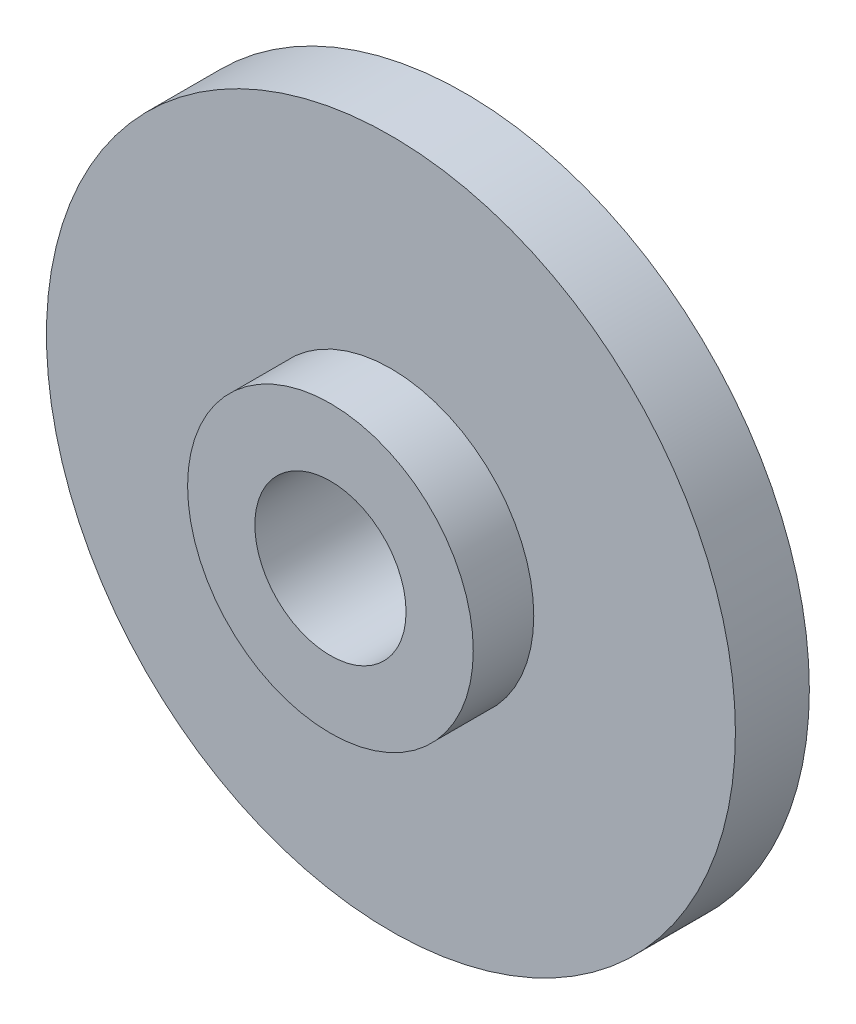
ISO-10303-21;
HEADER;
FILE_DESCRIPTION(('STEP AP214'),'2;1');
FILE_NAME('part.step','',(''),(''),'','','');
FILE_SCHEMA(('AUTOMOTIVE_DESIGN { 1 0 10303 214 1 1 1 1 }'));
ENDSEC;
DATA;
#1=APPLICATION_CONTEXT('core data for automotive mechanical design processes');
#2=APPLICATION_PROTOCOL_DEFINITION('international standard','automotive_design',2000,#1);
#3=PRODUCT_CONTEXT('',#1,'mechanical');
#4=PRODUCT('Part','Part','',(#3));
#5=PRODUCT_RELATED_PRODUCT_CATEGORY('part','',(#4));
#6=PRODUCT_DEFINITION_FORMATION('','',#4);
#7=PRODUCT_DEFINITION_CONTEXT('part definition',#1,'design');
#8=PRODUCT_DEFINITION('design','',#6,#7);
#9=PRODUCT_DEFINITION_SHAPE('','',#8);
#10=(LENGTH_UNIT() NAMED_UNIT(*) SI_UNIT(.MILLI.,.METRE.));
#11=(NAMED_UNIT(*) PLANE_ANGLE_UNIT() SI_UNIT($,.RADIAN.));
#12=(NAMED_UNIT(*) SI_UNIT($,.STERADIAN.) SOLID_ANGLE_UNIT());
#13=UNCERTAINTY_MEASURE_WITH_UNIT(LENGTH_MEASURE(1.E-05),#10,'distance_accuracy_value','');
#14=(GEOMETRIC_REPRESENTATION_CONTEXT(3) GLOBAL_UNCERTAINTY_ASSIGNED_CONTEXT((#13)) GLOBAL_UNIT_ASSIGNED_CONTEXT((#10,
#11,#12)) REPRESENTATION_CONTEXT('',''));
#15=CARTESIAN_POINT('',(0.,0.,0.));
#16=DIRECTION('',(0.,0.,1.));
#17=DIRECTION('',(1.,0.,0.));
#18=AXIS2_PLACEMENT_3D('',#15,#16,#17);
#19=CARTESIAN_POINT('',(0.,0.,2.2));
#20=DIRECTION('',(0.,0.,-1.));
#21=DIRECTION('',(-1.,0.,0.));
#22=AXIS2_PLACEMENT_3D('',#19,#20,#21);
#23=CYLINDRICAL_SURFACE('',#22,10.25);
#24=CARTESIAN_POINT('',(0.,0.,2.2));
#25=DIRECTION('',(0.,0.,1.));
#26=DIRECTION('',(1.,0.,0.));
#27=AXIS2_PLACEMENT_3D('',#24,#25,#26);
#28=CIRCLE('',#27,10.25);
#29=CARTESIAN_POINT('',(10.25,0.,2.2));
#30=VERTEX_POINT('',#29);
#31=EDGE_CURVE('E10',#30,#30,#28,.T.);
#32=ORIENTED_EDGE('',*,*,#31,.F.);
#33=EDGE_LOOP('',(#32));
#34=FACE_BOUND('',#33,.T.);
#35=CARTESIAN_POINT('',(0.,0.,0.));
#36=DIRECTION('',(0.,0.,1.));
#37=DIRECTION('',(1.,0.,0.));
#38=AXIS2_PLACEMENT_3D('',#35,#36,#37);
#39=CIRCLE('',#38,10.25);
#40=CARTESIAN_POINT('',(10.25,0.,0.));
#41=VERTEX_POINT('',#40);
#42=EDGE_CURVE('E44',#41,#41,#39,.T.);
#43=ORIENTED_EDGE('',*,*,#42,.T.);
#44=EDGE_LOOP('',(#43));
#45=FACE_BOUND('',#44,.T.);
#46=ADVANCED_FACE('F41',(#34,#45),#23,.T.);
#47=CARTESIAN_POINT('',(0.,0.,2.2));
#48=DIRECTION('',(0.,0.,1.));
#49=DIRECTION('',(1.,0.,0.));
#50=AXIS2_PLACEMENT_3D('',#47,#48,#49);
#51=PLANE('',#50);
#52=CARTESIAN_POINT('',(0.,0.,2.2));
#53=DIRECTION('',(0.,0.,1.));
#54=DIRECTION('',(1.,0.,0.));
#55=AXIS2_PLACEMENT_3D('',#52,#53,#54);
#56=CIRCLE('',#55,4.25);
#57=CARTESIAN_POINT('',(4.25,0.,2.2));
#58=VERTEX_POINT('',#57);
#59=EDGE_CURVE('E49',#58,#58,#56,.T.);
#60=ORIENTED_EDGE('',*,*,#59,.F.);
#61=EDGE_LOOP('',(#60));
#62=FACE_BOUND('',#61,.T.);
#63=ORIENTED_EDGE('',*,*,#31,.T.);
#64=EDGE_LOOP('',(#63));
#65=FACE_BOUND('',#64,.T.);
#66=ADVANCED_FACE('F88',(#62,#65),#51,.T.);
#67=CARTESIAN_POINT('',(0.,0.,0.));
#68=DIRECTION('',(0.,0.,1.));
#69=DIRECTION('',(1.,0.,0.));
#70=AXIS2_PLACEMENT_3D('',#67,#68,#69);
#71=PLANE('',#70);
#72=ORIENTED_EDGE('',*,*,#42,.F.);
#73=EDGE_LOOP('',(#72));
#74=FACE_BOUND('',#73,.T.);
#75=CARTESIAN_POINT('',(0.,0.,0.));
#76=DIRECTION('',(0.,0.,1.));
#77=DIRECTION('',(1.,0.,0.));
#78=AXIS2_PLACEMENT_3D('',#75,#76,#77);
#79=CIRCLE('',#78,2.25);
#80=CARTESIAN_POINT('',(2.25,0.,0.));
#81=VERTEX_POINT('',#80);
#82=EDGE_CURVE('E56',#81,#81,#79,.T.);
#83=ORIENTED_EDGE('',*,*,#82,.T.);
#84=EDGE_LOOP('',(#83));
#85=FACE_BOUND('',#84,.T.);
#86=ADVANCED_FACE('F85',(#74,#85),#71,.F.);
#87=CARTESIAN_POINT('',(0.,0.,4.));
#88=DIRECTION('',(0.,0.,-1.));
#89=DIRECTION('',(-1.,0.,0.));
#90=AXIS2_PLACEMENT_3D('',#87,#88,#89);
#91=CYLINDRICAL_SURFACE('',#90,2.25);
#92=CARTESIAN_POINT('',(0.,0.,4.));
#93=DIRECTION('',(0.,0.,1.));
#94=DIRECTION('',(1.,0.,0.));
#95=AXIS2_PLACEMENT_3D('',#92,#93,#94);
#96=CIRCLE('',#95,2.25);
#97=CARTESIAN_POINT('',(2.25,0.,4.));
#98=VERTEX_POINT('',#97);
#99=EDGE_CURVE('E60',#98,#98,#96,.T.);
#100=ORIENTED_EDGE('',*,*,#99,.T.);
#101=EDGE_LOOP('',(#100));
#102=FACE_BOUND('',#101,.T.);
#103=ORIENTED_EDGE('',*,*,#82,.F.);
#104=EDGE_LOOP('',(#103));
#105=FACE_BOUND('',#104,.T.);
#106=ADVANCED_FACE('F69',(#102,#105),#91,.F.);
#107=CARTESIAN_POINT('',(0.,0.,4.));
#108=DIRECTION('',(0.,0.,-1.));
#109=DIRECTION('',(-1.,0.,0.));
#110=AXIS2_PLACEMENT_3D('',#107,#108,#109);
#111=CYLINDRICAL_SURFACE('',#110,4.25);
#112=ORIENTED_EDGE('',*,*,#59,.T.);
#113=EDGE_LOOP('',(#112));
#114=FACE_BOUND('',#113,.T.);
#115=CARTESIAN_POINT('',(0.,0.,4.));
#116=DIRECTION('',(0.,0.,1.));
#117=DIRECTION('',(1.,0.,0.));
#118=AXIS2_PLACEMENT_3D('',#115,#116,#117);
#119=CIRCLE('',#118,4.25);
#120=CARTESIAN_POINT('',(4.25,0.,4.));
#121=VERTEX_POINT('',#120);
#122=EDGE_CURVE('E61',#121,#121,#119,.T.);
#123=ORIENTED_EDGE('',*,*,#122,.F.);
#124=EDGE_LOOP('',(#123));
#125=FACE_BOUND('',#124,.T.);
#126=ADVANCED_FACE('F75',(#114,#125),#111,.T.);
#127=CARTESIAN_POINT('',(0.,0.,4.));
#128=DIRECTION('',(0.,0.,1.));
#129=DIRECTION('',(1.,0.,0.));
#130=AXIS2_PLACEMENT_3D('',#127,#128,#129);
#131=PLANE('',#130);
#132=ORIENTED_EDGE('',*,*,#99,.F.);
#133=EDGE_LOOP('',(#132));
#134=FACE_BOUND('',#133,.T.);
#135=ORIENTED_EDGE('',*,*,#122,.T.);
#136=EDGE_LOOP('',(#135));
#137=FACE_BOUND('',#136,.T.);
#138=ADVANCED_FACE('F72',(#134,#137),#131,.T.);
#139=CLOSED_SHELL('',(#46,#66,#86,#106,#126,#138));
#140=MANIFOLD_SOLID_BREP('B2',#139);
#141=ADVANCED_BREP_SHAPE_REPRESENTATION('',(#18,#140),#14);
#142=SHAPE_DEFINITION_REPRESENTATION(#9,#141);
ENDSEC;
END-ISO-10303-21;
